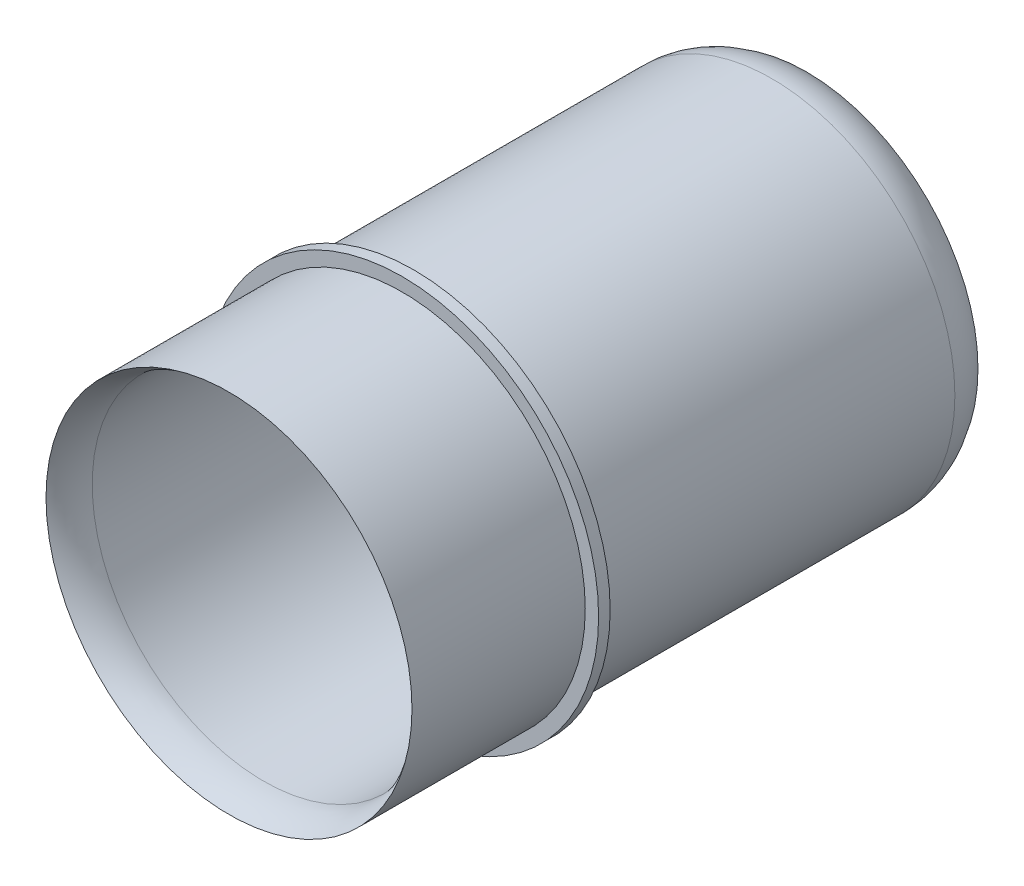
ISO-10303-21;
HEADER;
FILE_DESCRIPTION(('STEP AP214'),'2;1');
FILE_NAME('part.step','',(''),(''),'','','');
FILE_SCHEMA(('AUTOMOTIVE_DESIGN { 1 0 10303 214 1 1 1 1 }'));
ENDSEC;
DATA;
#1=APPLICATION_CONTEXT('core data for automotive mechanical design processes');
#2=APPLICATION_PROTOCOL_DEFINITION('international standard','automotive_design',2000,#1);
#3=PRODUCT_CONTEXT('',#1,'mechanical');
#4=PRODUCT('Part','Part','',(#3));
#5=PRODUCT_RELATED_PRODUCT_CATEGORY('part','',(#4));
#6=PRODUCT_DEFINITION_FORMATION('','',#4);
#7=PRODUCT_DEFINITION_CONTEXT('part definition',#1,'design');
#8=PRODUCT_DEFINITION('design','',#6,#7);
#9=PRODUCT_DEFINITION_SHAPE('','',#8);
#10=(LENGTH_UNIT() NAMED_UNIT(*) SI_UNIT(.MILLI.,.METRE.));
#11=(NAMED_UNIT(*) PLANE_ANGLE_UNIT() SI_UNIT($,.RADIAN.));
#12=(NAMED_UNIT(*) SI_UNIT($,.STERADIAN.) SOLID_ANGLE_UNIT());
#13=UNCERTAINTY_MEASURE_WITH_UNIT(LENGTH_MEASURE(1.E-05),#10,'distance_accuracy_value','');
#14=(GEOMETRIC_REPRESENTATION_CONTEXT(3) GLOBAL_UNCERTAINTY_ASSIGNED_CONTEXT((#13)) GLOBAL_UNIT_ASSIGNED_CONTEXT((#10,
#11,#12)) REPRESENTATION_CONTEXT('',''));
#15=CARTESIAN_POINT('',(0.,0.,0.));
#16=DIRECTION('',(0.,0.,1.));
#17=DIRECTION('',(1.,0.,0.));
#18=AXIS2_PLACEMENT_3D('',#15,#16,#17);
#19=CARTESIAN_POINT('',(0.,0.,50.));
#20=DIRECTION('',(0.,0.,-1.));
#21=DIRECTION('',(-1.,0.,0.));
#22=AXIS2_PLACEMENT_3D('',#19,#20,#21);
#23=CYLINDRICAL_SURFACE('',#22,31.685);
#24=CARTESIAN_POINT('',(0.,0.,-44.));
#25=DIRECTION('',(0.,0.,-1.));
#26=DIRECTION('',(-1.,0.,0.));
#27=AXIS2_PLACEMENT_3D('',#24,#25,#26);
#28=CIRCLE('',#27,31.685);
#29=CARTESIAN_POINT('',(-31.685,0.,-44.));
#30=VERTEX_POINT('',#29);
#31=EDGE_CURVE('E47',#30,#30,#28,.F.);
#32=ORIENTED_EDGE('',*,*,#31,.T.);
#33=EDGE_LOOP('',(#32));
#34=FACE_BOUND('',#33,.T.);
#35=CARTESIAN_POINT('',(0.,0.,18.));
#36=DIRECTION('',(0.,0.,1.));
#37=DIRECTION('',(1.,0.,0.));
#38=AXIS2_PLACEMENT_3D('',#35,#36,#37);
#39=CIRCLE('',#38,31.685);
#40=CARTESIAN_POINT('',(31.685,0.,18.));
#41=VERTEX_POINT('',#40);
#42=EDGE_CURVE('E52',#41,#41,#39,.T.);
#43=ORIENTED_EDGE('',*,*,#42,.F.);
#44=EDGE_LOOP('',(#43));
#45=FACE_BOUND('',#44,.T.);
#46=ADVANCED_FACE('F39',(#34,#45),#23,.T.);
#47=CARTESIAN_POINT('',(0.,0.,20.));
#48=DIRECTION('',(0.,0.,1.));
#49=DIRECTION('',(1.,0.,0.));
#50=AXIS2_PLACEMENT_3D('',#47,#48,#49);
#51=CIRCLE('',#50,31.685);
#52=CARTESIAN_POINT('',(31.685,0.,20.));
#53=VERTEX_POINT('',#52);
#54=EDGE_CURVE('E67',#53,#53,#51,.T.);
#55=ORIENTED_EDGE('',*,*,#54,.T.);
#56=EDGE_LOOP('',(#55));
#57=FACE_BOUND('',#56,.T.);
#58=CARTESIAN_POINT('',(0.,0.,50.));
#59=DIRECTION('',(0.,0.,1.));
#60=DIRECTION('',(1.,0.,0.));
#61=AXIS2_PLACEMENT_3D('',#58,#59,#60);
#62=CIRCLE('',#61,31.685);
#63=CARTESIAN_POINT('',(31.685,0.,50.));
#64=VERTEX_POINT('',#63);
#65=EDGE_CURVE('E57',#64,#64,#62,.T.);
#66=ORIENTED_EDGE('',*,*,#65,.F.);
#67=EDGE_LOOP('',(#66));
#68=FACE_BOUND('',#67,.T.);
#69=ADVANCED_FACE('F97',(#57,#68),#23,.T.);
#70=CARTESIAN_POINT('',(0.,0.,50.));
#71=DIRECTION('',(0.,0.,-1.));
#72=DIRECTION('',(-1.,0.,0.));
#73=AXIS2_PLACEMENT_3D('',#70,#71,#72);
#74=CYLINDRICAL_SURFACE('',#73,29.685);
#75=CARTESIAN_POINT('',(0.,0.,44.));
#76=DIRECTION('',(0.,0.,1.));
#77=DIRECTION('',(1.,0.,0.));
#78=AXIS2_PLACEMENT_3D('',#75,#76,#77);
#79=CIRCLE('',#78,29.685);
#80=CARTESIAN_POINT('',(29.685,0.,44.));
#81=VERTEX_POINT('',#80);
#82=EDGE_CURVE('E10',#81,#81,#79,.T.);
#83=ORIENTED_EDGE('',*,*,#82,.T.);
#84=EDGE_LOOP('',(#83));
#85=FACE_BOUND('',#84,.T.);
#86=CARTESIAN_POINT('',(0.,0.,-50.));
#87=DIRECTION('',(0.,0.,1.));
#88=DIRECTION('',(1.,0.,0.));
#89=AXIS2_PLACEMENT_3D('',#86,#87,#88);
#90=CIRCLE('',#89,29.685);
#91=CARTESIAN_POINT('',(29.685,0.,-50.));
#92=VERTEX_POINT('',#91);
#93=EDGE_CURVE('E63',#92,#92,#90,.T.);
#94=ORIENTED_EDGE('',*,*,#93,.F.);
#95=EDGE_LOOP('',(#94));
#96=FACE_BOUND('',#95,.T.);
#97=ADVANCED_FACE('F102',(#85,#96),#74,.F.);
#98=CARTESIAN_POINT('',(0.,0.,20.));
#99=DIRECTION('',(0.,0.,1.));
#100=DIRECTION('',(1.,0.,0.));
#101=AXIS2_PLACEMENT_3D('',#98,#99,#100);
#102=PLANE('',#101);
#103=CARTESIAN_POINT('',(0.,0.,20.));
#104=DIRECTION('',(0.,0.,1.));
#105=DIRECTION('',(1.,0.,0.));
#106=AXIS2_PLACEMENT_3D('',#103,#104,#105);
#107=CIRCLE('',#106,34.);
#108=CARTESIAN_POINT('',(34.,0.,20.));
#109=VERTEX_POINT('',#108);
#110=EDGE_CURVE('E70',#109,#109,#107,.T.);
#111=ORIENTED_EDGE('',*,*,#110,.T.);
#112=EDGE_LOOP('',(#111));
#113=FACE_BOUND('',#112,.T.);
#114=ORIENTED_EDGE('',*,*,#54,.F.);
#115=EDGE_LOOP('',(#114));
#116=FACE_BOUND('',#115,.T.);
#117=ADVANCED_FACE('F80',(#113,#116),#102,.T.);
#118=CARTESIAN_POINT('',(0.,0.,18.));
#119=DIRECTION('',(0.,0.,1.));
#120=DIRECTION('',(1.,0.,0.));
#121=AXIS2_PLACEMENT_3D('',#118,#119,#120);
#122=PLANE('',#121);
#123=CARTESIAN_POINT('',(0.,0.,18.));
#124=DIRECTION('',(0.,0.,1.));
#125=DIRECTION('',(1.,0.,0.));
#126=AXIS2_PLACEMENT_3D('',#123,#124,#125);
#127=CIRCLE('',#126,34.);
#128=CARTESIAN_POINT('',(34.,0.,18.));
#129=VERTEX_POINT('',#128);
#130=EDGE_CURVE('E72',#129,#129,#127,.T.);
#131=ORIENTED_EDGE('',*,*,#130,.F.);
#132=EDGE_LOOP('',(#131));
#133=FACE_BOUND('',#132,.T.);
#134=ORIENTED_EDGE('',*,*,#42,.T.);
#135=EDGE_LOOP('',(#134));
#136=FACE_BOUND('',#135,.T.);
#137=ADVANCED_FACE('F87',(#133,#136),#122,.F.);
#138=CARTESIAN_POINT('',(0.,0.,20.));
#139=DIRECTION('',(0.,0.,-1.));
#140=DIRECTION('',(-1.,0.,0.));
#141=AXIS2_PLACEMENT_3D('',#138,#139,#140);
#142=CYLINDRICAL_SURFACE('',#141,34.);
#143=ORIENTED_EDGE('',*,*,#110,.F.);
#144=EDGE_LOOP('',(#143));
#145=FACE_BOUND('',#144,.T.);
#146=ORIENTED_EDGE('',*,*,#130,.T.);
#147=EDGE_LOOP('',(#146));
#148=FACE_BOUND('',#147,.T.);
#149=ADVANCED_FACE('F83',(#145,#148),#142,.T.);
#150=CARTESIAN_POINT('',(0.,0.,-44.));
#151=DIRECTION('',(0.,0.,-1.));
#152=DIRECTION('',(-1.,0.,0.));
#153=AXIS2_PLACEMENT_3D('',#150,#151,#152);
#154=TOROIDAL_SURFACE('',#153,21.685,10.);
#155=ORIENTED_EDGE('',*,*,#93,.T.);
#156=EDGE_LOOP('',(#155));
#157=FACE_BOUND('',#156,.T.);
#158=ORIENTED_EDGE('',*,*,#31,.F.);
#159=EDGE_LOOP('',(#158));
#160=FACE_BOUND('',#159,.T.);
#161=ADVANCED_FACE('F86',(#157,#160),#154,.T.);
#162=CARTESIAN_POINT('',(0.,0.,44.));
#163=DIRECTION('',(0.,0.,1.));
#164=DIRECTION('',(1.,0.,0.));
#165=AXIS2_PLACEMENT_3D('',#162,#163,#164);
#166=TOROIDAL_SURFACE('',#165,39.685,10.);
#167=ORIENTED_EDGE('',*,*,#65,.T.);
#168=EDGE_LOOP('',(#167));
#169=FACE_BOUND('',#168,.T.);
#170=ORIENTED_EDGE('',*,*,#82,.F.);
#171=EDGE_LOOP('',(#170));
#172=FACE_BOUND('',#171,.T.);
#173=ADVANCED_FACE('F41',(#169,#172),#166,.T.);
#174=CLOSED_SHELL('',(#46,#69,#97,#117,#137,#149,#161,#173));
#175=MANIFOLD_SOLID_BREP('B2',#174);
#176=ADVANCED_BREP_SHAPE_REPRESENTATION('',(#18,#175),#14);
#177=SHAPE_DEFINITION_REPRESENTATION(#9,#176);
ENDSEC;
END-ISO-10303-21;
